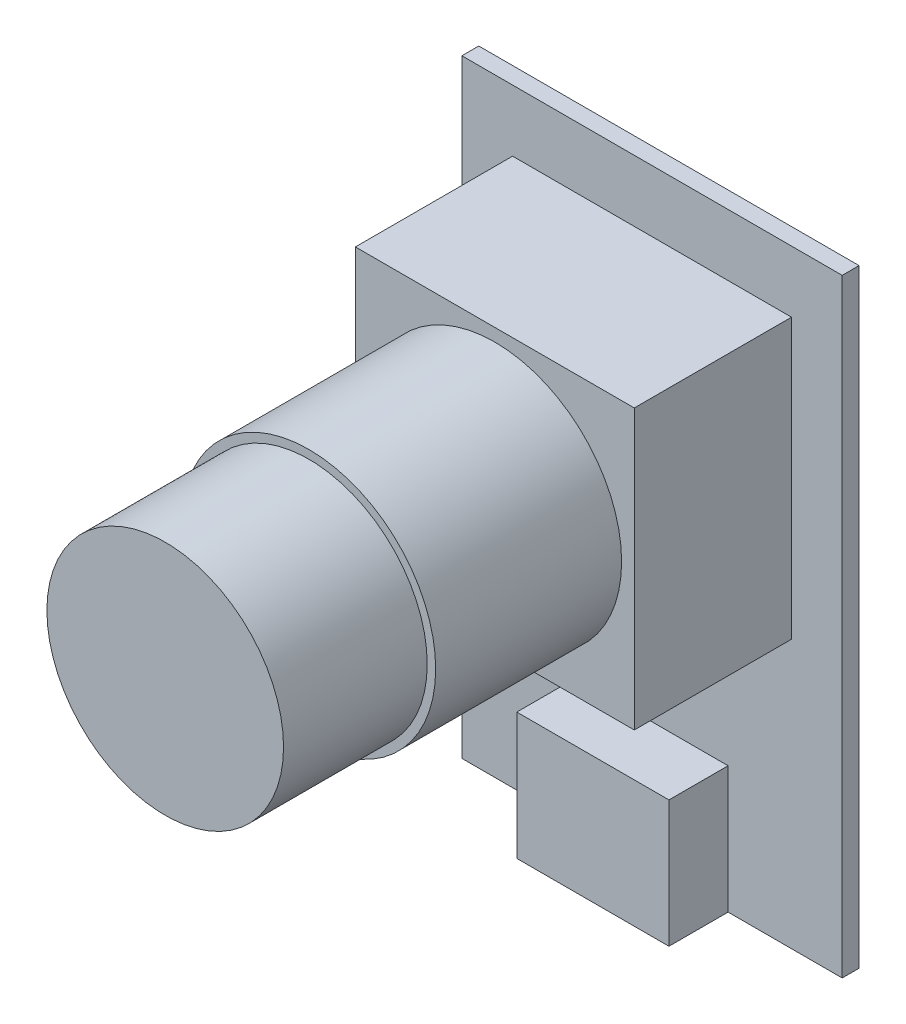
ISO-10303-21;
HEADER;
FILE_DESCRIPTION(('STEP AP214'),'2;1');
FILE_NAME('part.step','',(''),(''),'','','');
FILE_SCHEMA(('AUTOMOTIVE_DESIGN { 1 0 10303 214 1 1 1 1 }'));
ENDSEC;
DATA;
#1=APPLICATION_CONTEXT('core data for automotive mechanical design processes');
#2=APPLICATION_PROTOCOL_DEFINITION('international standard','automotive_design',2000,#1);
#3=PRODUCT_CONTEXT('',#1,'mechanical');
#4=PRODUCT('Part','Part','',(#3));
#5=PRODUCT_RELATED_PRODUCT_CATEGORY('part','',(#4));
#6=PRODUCT_DEFINITION_FORMATION('','',#4);
#7=PRODUCT_DEFINITION_CONTEXT('part definition',#1,'design');
#8=PRODUCT_DEFINITION('design','',#6,#7);
#9=PRODUCT_DEFINITION_SHAPE('','',#8);
#10=(LENGTH_UNIT() NAMED_UNIT(*) SI_UNIT(.MILLI.,.METRE.));
#11=(NAMED_UNIT(*) PLANE_ANGLE_UNIT() SI_UNIT($,.RADIAN.));
#12=(NAMED_UNIT(*) SI_UNIT($,.STERADIAN.) SOLID_ANGLE_UNIT());
#13=UNCERTAINTY_MEASURE_WITH_UNIT(LENGTH_MEASURE(1.E-05),#10,'distance_accuracy_value','');
#14=(GEOMETRIC_REPRESENTATION_CONTEXT(3) GLOBAL_UNCERTAINTY_ASSIGNED_CONTEXT((#13)) GLOBAL_UNIT_ASSIGNED_CONTEXT((#10,
#11,#12)) REPRESENTATION_CONTEXT('',''));
#15=CARTESIAN_POINT('',(0.,0.,0.));
#16=DIRECTION('',(0.,0.,1.));
#17=DIRECTION('',(1.,0.,0.));
#18=AXIS2_PLACEMENT_3D('',#15,#16,#17);
#19=CARTESIAN_POINT('',(0.,0.,1.));
#20=DIRECTION('',(0.,0.,-1.));
#21=DIRECTION('',(-1.,0.,0.));
#22=AXIS2_PLACEMENT_3D('',#19,#20,#21);
#23=PLANE('',#22);
#24=DIRECTION('',(0.,1.,0.));
#25=VECTOR('',#24,1.);
#26=CARTESIAN_POINT('',(8.25,14.3566777408638,1.));
#27=LINE('',#26,#25);
#28=CARTESIAN_POINT('',(8.25,-2.14332225913621,1.));
#29=VERTEX_POINT('',#28);
#30=CARTESIAN_POINT('',(8.25,14.3566777408638,1.));
#31=VERTEX_POINT('',#30);
#32=EDGE_CURVE('E214',#29,#31,#27,.T.);
#33=ORIENTED_EDGE('',*,*,#32,.F.);
#34=DIRECTION('',(1.,0.,0.));
#35=VECTOR('',#34,1.);
#36=CARTESIAN_POINT('',(-8.25,-2.14332225913621,1.));
#37=LINE('',#36,#35);
#38=CARTESIAN_POINT('',(-8.25,-2.14332225913621,1.));
#39=VERTEX_POINT('',#38);
#40=EDGE_CURVE('E224',#39,#29,#37,.T.);
#41=ORIENTED_EDGE('',*,*,#40,.F.);
#42=DIRECTION('',(0.,-1.,0.));
#43=VECTOR('',#42,1.);
#44=CARTESIAN_POINT('',(-8.25,14.3566777408638,1.));
#45=LINE('',#44,#43);
#46=CARTESIAN_POINT('',(-8.25,14.3566777408638,1.));
#47=VERTEX_POINT('',#46);
#48=EDGE_CURVE('E232',#47,#39,#45,.T.);
#49=ORIENTED_EDGE('',*,*,#48,.F.);
#50=DIRECTION('',(-1.,0.,0.));
#51=VECTOR('',#50,1.);
#52=CARTESIAN_POINT('',(-8.25,14.3566777408638,1.));
#53=LINE('',#52,#51);
#54=EDGE_CURVE('E231',#31,#47,#53,.T.);
#55=ORIENTED_EDGE('',*,*,#54,.F.);
#56=EDGE_LOOP('',(#33,#41,#49,#55));
#57=FACE_BOUND('',#56,.T.);
#58=DIRECTION('',(0.,-1.,0.));
#59=VECTOR('',#58,1.);
#60=CARTESIAN_POINT('',(-4.5,-10.5,1.));
#61=LINE('',#60,#59);
#62=CARTESIAN_POINT('',(-4.5,-10.5,1.));
#63=VERTEX_POINT('',#62);
#64=CARTESIAN_POINT('',(-4.5,-18.,1.));
#65=VERTEX_POINT('',#64);
#66=EDGE_CURVE('E180',#63,#65,#61,.T.);
#67=ORIENTED_EDGE('',*,*,#66,.F.);
#68=DIRECTION('',(1.,0.,0.));
#69=VECTOR('',#68,1.);
#70=CARTESIAN_POINT('',(-4.5,-10.5,1.));
#71=LINE('',#70,#69);
#72=CARTESIAN_POINT('',(4.5,-10.5,1.));
#73=VERTEX_POINT('',#72);
#74=EDGE_CURVE('E190',#63,#73,#71,.T.);
#75=ORIENTED_EDGE('',*,*,#74,.T.);
#76=DIRECTION('',(0.,-1.,0.));
#77=VECTOR('',#76,1.);
#78=CARTESIAN_POINT('',(4.5,-10.5,1.));
#79=LINE('',#78,#77);
#80=CARTESIAN_POINT('',(4.5,-18.,1.));
#81=VERTEX_POINT('',#80);
#82=EDGE_CURVE('E63',#73,#81,#79,.T.);
#83=ORIENTED_EDGE('',*,*,#82,.T.);
#84=DIRECTION('',(1.,0.,0.));
#85=VECTOR('',#84,1.);
#86=CARTESIAN_POINT('',(-11.25,-18.,1.));
#87=LINE('',#86,#85);
#88=CARTESIAN_POINT('',(11.25,-18.,1.));
#89=VERTEX_POINT('',#88);
#90=EDGE_CURVE('E259',#81,#89,#87,.T.);
#91=ORIENTED_EDGE('',*,*,#90,.T.);
#92=DIRECTION('',(0.,-1.,0.));
#93=VECTOR('',#92,1.);
#94=CARTESIAN_POINT('',(11.25,18.,1.));
#95=LINE('',#94,#93);
#96=CARTESIAN_POINT('',(11.25,18.,1.));
#97=VERTEX_POINT('',#96);
#98=EDGE_CURVE('E254',#97,#89,#95,.T.);
#99=ORIENTED_EDGE('',*,*,#98,.F.);
#100=DIRECTION('',(1.,0.,0.));
#101=VECTOR('',#100,1.);
#102=CARTESIAN_POINT('',(-11.25,18.,1.));
#103=LINE('',#102,#101);
#104=CARTESIAN_POINT('',(-11.25,18.,1.));
#105=VERTEX_POINT('',#104);
#106=EDGE_CURVE('E252',#105,#97,#103,.T.);
#107=ORIENTED_EDGE('',*,*,#106,.F.);
#108=DIRECTION('',(0.,-1.,0.));
#109=VECTOR('',#108,1.);
#110=CARTESIAN_POINT('',(-11.25,18.,1.));
#111=LINE('',#110,#109);
#112=CARTESIAN_POINT('',(-11.25,-18.,1.));
#113=VERTEX_POINT('',#112);
#114=EDGE_CURVE('E263',#105,#113,#111,.T.);
#115=ORIENTED_EDGE('',*,*,#114,.T.);
#116=EDGE_CURVE('E257',#113,#65,#87,.T.);
#117=ORIENTED_EDGE('',*,*,#116,.T.);
#118=EDGE_LOOP('',(#67,#75,#83,#91,#99,#107,#115,#117));
#119=FACE_BOUND('',#118,.T.);
#120=ADVANCED_FACE('F39',(#57,#119),#23,.F.);
#121=CARTESIAN_POINT('',(-11.25,18.,1.));
#122=DIRECTION('',(0.,1.,0.));
#123=DIRECTION('',(0.,0.,1.));
#124=AXIS2_PLACEMENT_3D('',#121,#122,#123);
#125=PLANE('',#124);
#126=DIRECTION('',(1.,0.,0.));
#127=VECTOR('',#126,1.);
#128=CARTESIAN_POINT('',(-11.25,18.,0.));
#129=LINE('',#128,#127);
#130=CARTESIAN_POINT('',(-11.25,18.,0.));
#131=VERTEX_POINT('',#130);
#132=CARTESIAN_POINT('',(11.25,18.,0.));
#133=VERTEX_POINT('',#132);
#134=EDGE_CURVE('E253',#131,#133,#129,.T.);
#135=ORIENTED_EDGE('',*,*,#134,.F.);
#136=DIRECTION('',(0.,0.,-1.));
#137=VECTOR('',#136,1.);
#138=CARTESIAN_POINT('',(-11.25,18.,1.));
#139=LINE('',#138,#137);
#140=EDGE_CURVE('E217',#105,#131,#139,.T.);
#141=ORIENTED_EDGE('',*,*,#140,.F.);
#142=ORIENTED_EDGE('',*,*,#106,.T.);
#143=DIRECTION('',(0.,0.,-1.));
#144=VECTOR('',#143,1.);
#145=CARTESIAN_POINT('',(11.25,18.,1.));
#146=LINE('',#145,#144);
#147=EDGE_CURVE('E43',#97,#133,#146,.T.);
#148=ORIENTED_EDGE('',*,*,#147,.T.);
#149=EDGE_LOOP('',(#135,#141,#142,#148));
#150=FACE_BOUND('',#149,.T.);
#151=ADVANCED_FACE('F41',(#150),#125,.T.);
#152=CARTESIAN_POINT('',(-11.25,18.,1.));
#153=DIRECTION('',(1.,0.,0.));
#154=DIRECTION('',(0.,1.,0.));
#155=AXIS2_PLACEMENT_3D('',#152,#153,#154);
#156=PLANE('',#155);
#157=DIRECTION('',(0.,-1.,0.));
#158=VECTOR('',#157,1.);
#159=CARTESIAN_POINT('',(-11.25,18.,0.));
#160=LINE('',#159,#158);
#161=CARTESIAN_POINT('',(-11.25,-18.,0.));
#162=VERTEX_POINT('',#161);
#163=EDGE_CURVE('E258',#131,#162,#160,.T.);
#164=ORIENTED_EDGE('',*,*,#163,.T.);
#165=DIRECTION('',(0.,0.,-1.));
#166=VECTOR('',#165,1.);
#167=CARTESIAN_POINT('',(-11.25,-18.,1.));
#168=LINE('',#167,#166);
#169=EDGE_CURVE('E274',#113,#162,#168,.T.);
#170=ORIENTED_EDGE('',*,*,#169,.F.);
#171=ORIENTED_EDGE('',*,*,#114,.F.);
#172=ORIENTED_EDGE('',*,*,#140,.T.);
#173=EDGE_LOOP('',(#164,#170,#171,#172));
#174=FACE_BOUND('',#173,.T.);
#175=ADVANCED_FACE('F291',(#174),#156,.F.);
#176=CARTESIAN_POINT('',(-11.25,-18.,1.));
#177=DIRECTION('',(0.,1.,0.));
#178=DIRECTION('',(0.,0.,1.));
#179=AXIS2_PLACEMENT_3D('',#176,#177,#178);
#180=PLANE('',#179);
#181=DIRECTION('',(1.,0.,0.));
#182=VECTOR('',#181,1.);
#183=CARTESIAN_POINT('',(-11.25,-18.,0.));
#184=LINE('',#183,#182);
#185=CARTESIAN_POINT('',(-5.5,-18.,0.));
#186=VERTEX_POINT('',#185);
#187=EDGE_CURVE('E271',#162,#186,#184,.T.);
#188=ORIENTED_EDGE('',*,*,#187,.T.);
#189=DIRECTION('',(0.,0.,1.));
#190=VECTOR('',#189,1.);
#191=CARTESIAN_POINT('',(-5.5,-18.,-2.));
#192=LINE('',#191,#190);
#193=CARTESIAN_POINT('',(-5.5,-18.,-2.));
#194=VERTEX_POINT('',#193);
#195=EDGE_CURVE('E57',#194,#186,#192,.T.);
#196=ORIENTED_EDGE('',*,*,#195,.F.);
#197=DIRECTION('',(-1.,0.,0.));
#198=VECTOR('',#197,1.);
#199=CARTESIAN_POINT('',(5.5,-18.,-2.));
#200=LINE('',#199,#198);
#201=CARTESIAN_POINT('',(5.5,-18.,-2.));
#202=VERTEX_POINT('',#201);
#203=EDGE_CURVE('E152',#202,#194,#200,.T.);
#204=ORIENTED_EDGE('',*,*,#203,.F.);
#205=DIRECTION('',(0.,0.,1.));
#206=VECTOR('',#205,1.);
#207=CARTESIAN_POINT('',(5.5,-18.,-2.));
#208=LINE('',#207,#206);
#209=CARTESIAN_POINT('',(5.5,-18.,0.));
#210=VERTEX_POINT('',#209);
#211=EDGE_CURVE('E157',#202,#210,#208,.T.);
#212=ORIENTED_EDGE('',*,*,#211,.T.);
#213=CARTESIAN_POINT('',(11.25,-18.,0.));
#214=VERTEX_POINT('',#213);
#215=EDGE_CURVE('E269',#210,#214,#184,.T.);
#216=ORIENTED_EDGE('',*,*,#215,.T.);
#217=DIRECTION('',(0.,0.,-1.));
#218=VECTOR('',#217,1.);
#219=CARTESIAN_POINT('',(11.25,-18.,1.));
#220=LINE('',#219,#218);
#221=EDGE_CURVE('E280',#89,#214,#220,.T.);
#222=ORIENTED_EDGE('',*,*,#221,.F.);
#223=ORIENTED_EDGE('',*,*,#90,.F.);
#224=DIRECTION('',(0.,0.,-1.));
#225=VECTOR('',#224,1.);
#226=CARTESIAN_POINT('',(4.5,-18.,4.5));
#227=LINE('',#226,#225);
#228=CARTESIAN_POINT('',(4.5,-18.,4.5));
#229=VERTEX_POINT('',#228);
#230=EDGE_CURVE('E202',#229,#81,#227,.T.);
#231=ORIENTED_EDGE('',*,*,#230,.F.);
#232=DIRECTION('',(1.,0.,0.));
#233=VECTOR('',#232,1.);
#234=CARTESIAN_POINT('',(-4.5,-18.,4.5));
#235=LINE('',#234,#233);
#236=CARTESIAN_POINT('',(-4.5,-18.,4.5));
#237=VERTEX_POINT('',#236);
#238=EDGE_CURVE('E188',#237,#229,#235,.T.);
#239=ORIENTED_EDGE('',*,*,#238,.F.);
#240=DIRECTION('',(0.,0.,-1.));
#241=VECTOR('',#240,1.);
#242=CARTESIAN_POINT('',(-4.5,-18.,4.5));
#243=LINE('',#242,#241);
#244=EDGE_CURVE('E210',#237,#65,#243,.T.);
#245=ORIENTED_EDGE('',*,*,#244,.T.);
#246=ORIENTED_EDGE('',*,*,#116,.F.);
#247=ORIENTED_EDGE('',*,*,#169,.T.);
#248=EDGE_LOOP('',(#188,#196,#204,#212,#216,#222,#223,#231,#239,#245,#246,#247));
#249=FACE_BOUND('',#248,.T.);
#250=ADVANCED_FACE('F160',(#249),#180,.F.);
#251=CARTESIAN_POINT('',(11.25,18.,1.));
#252=DIRECTION('',(1.,0.,0.));
#253=DIRECTION('',(0.,1.,0.));
#254=AXIS2_PLACEMENT_3D('',#251,#252,#253);
#255=PLANE('',#254);
#256=DIRECTION('',(0.,-1.,0.));
#257=VECTOR('',#256,1.);
#258=CARTESIAN_POINT('',(11.25,18.,0.));
#259=LINE('',#258,#257);
#260=EDGE_CURVE('E270',#133,#214,#259,.T.);
#261=ORIENTED_EDGE('',*,*,#260,.F.);
#262=ORIENTED_EDGE('',*,*,#147,.F.);
#263=ORIENTED_EDGE('',*,*,#98,.T.);
#264=ORIENTED_EDGE('',*,*,#221,.T.);
#265=EDGE_LOOP('',(#261,#262,#263,#264));
#266=FACE_BOUND('',#265,.T.);
#267=ADVANCED_FACE('F289',(#266),#255,.T.);
#268=CARTESIAN_POINT('',(0.,0.,0.));
#269=DIRECTION('',(0.,0.,-1.));
#270=DIRECTION('',(-1.,0.,0.));
#271=AXIS2_PLACEMENT_3D('',#268,#269,#270);
#272=PLANE('',#271);
#273=DIRECTION('',(0.,-1.,0.));
#274=VECTOR('',#273,1.);
#275=CARTESIAN_POINT('',(5.5,-2.4,0.));
#276=LINE('',#275,#274);
#277=CARTESIAN_POINT('',(5.5,-2.4,0.));
#278=VERTEX_POINT('',#277);
#279=EDGE_CURVE('E179',#278,#210,#276,.T.);
#280=ORIENTED_EDGE('',*,*,#279,.F.);
#281=DIRECTION('',(-1.,0.,0.));
#282=VECTOR('',#281,1.);
#283=CARTESIAN_POINT('',(5.5,-2.4,0.));
#284=LINE('',#283,#282);
#285=CARTESIAN_POINT('',(-5.5,-2.4,0.));
#286=VERTEX_POINT('',#285);
#287=EDGE_CURVE('E172',#278,#286,#284,.T.);
#288=ORIENTED_EDGE('',*,*,#287,.T.);
#289=DIRECTION('',(0.,-1.,0.));
#290=VECTOR('',#289,1.);
#291=CARTESIAN_POINT('',(-5.5,-2.4,0.));
#292=LINE('',#291,#290);
#293=EDGE_CURVE('E305',#286,#186,#292,.T.);
#294=ORIENTED_EDGE('',*,*,#293,.T.);
#295=ORIENTED_EDGE('',*,*,#187,.F.);
#296=ORIENTED_EDGE('',*,*,#163,.F.);
#297=ORIENTED_EDGE('',*,*,#134,.T.);
#298=ORIENTED_EDGE('',*,*,#260,.T.);
#299=ORIENTED_EDGE('',*,*,#215,.F.);
#300=EDGE_LOOP('',(#280,#288,#294,#295,#296,#297,#298,#299));
#301=FACE_BOUND('',#300,.T.);
#302=ADVANCED_FACE('F288',(#301),#272,.T.);
#303=CARTESIAN_POINT('',(8.25,14.3566777408638,10.3));
#304=DIRECTION('',(-1.,0.,0.));
#305=DIRECTION('',(0.,-1.,0.));
#306=AXIS2_PLACEMENT_3D('',#303,#304,#305);
#307=PLANE('',#306);
#308=ORIENTED_EDGE('',*,*,#32,.T.);
#309=DIRECTION('',(0.,0.,-1.));
#310=VECTOR('',#309,1.);
#311=CARTESIAN_POINT('',(8.25,14.3566777408638,10.3));
#312=LINE('',#311,#310);
#313=CARTESIAN_POINT('',(8.25,14.3566777408638,10.3));
#314=VERTEX_POINT('',#313);
#315=EDGE_CURVE('E250',#314,#31,#312,.T.);
#316=ORIENTED_EDGE('',*,*,#315,.F.);
#317=DIRECTION('',(0.,1.,0.));
#318=VECTOR('',#317,1.);
#319=CARTESIAN_POINT('',(8.25,14.3566777408638,10.3));
#320=LINE('',#319,#318);
#321=CARTESIAN_POINT('',(8.25,-2.14332225913621,10.3));
#322=VERTEX_POINT('',#321);
#323=EDGE_CURVE('E218',#322,#314,#320,.T.);
#324=ORIENTED_EDGE('',*,*,#323,.F.);
#325=DIRECTION('',(0.,0.,-1.));
#326=VECTOR('',#325,1.);
#327=CARTESIAN_POINT('',(8.25,-2.14332225913621,10.3));
#328=LINE('',#327,#326);
#329=EDGE_CURVE('E228',#322,#29,#328,.T.);
#330=ORIENTED_EDGE('',*,*,#329,.T.);
#331=EDGE_LOOP('',(#308,#316,#324,#330));
#332=FACE_BOUND('',#331,.T.);
#333=ADVANCED_FACE('F334',(#332),#307,.F.);
#334=CARTESIAN_POINT('',(-8.25,14.3566777408638,10.3));
#335=DIRECTION('',(0.,-1.,0.));
#336=DIRECTION('',(0.,0.,-1.));
#337=AXIS2_PLACEMENT_3D('',#334,#335,#336);
#338=PLANE('',#337);
#339=ORIENTED_EDGE('',*,*,#54,.T.);
#340=DIRECTION('',(0.,0.,-1.));
#341=VECTOR('',#340,1.);
#342=CARTESIAN_POINT('',(-8.25,14.3566777408638,10.3));
#343=LINE('',#342,#341);
#344=CARTESIAN_POINT('',(-8.25,14.3566777408638,10.3));
#345=VERTEX_POINT('',#344);
#346=EDGE_CURVE('E245',#345,#47,#343,.T.);
#347=ORIENTED_EDGE('',*,*,#346,.F.);
#348=DIRECTION('',(-1.,0.,0.));
#349=VECTOR('',#348,1.);
#350=CARTESIAN_POINT('',(-8.25,14.3566777408638,10.3));
#351=LINE('',#350,#349);
#352=EDGE_CURVE('E225',#314,#345,#351,.T.);
#353=ORIENTED_EDGE('',*,*,#352,.F.);
#354=ORIENTED_EDGE('',*,*,#315,.T.);
#355=EDGE_LOOP('',(#339,#347,#353,#354));
#356=FACE_BOUND('',#355,.T.);
#357=ADVANCED_FACE('F353',(#356),#338,.F.);
#358=CARTESIAN_POINT('',(-8.25,14.3566777408638,10.3));
#359=DIRECTION('',(1.,0.,0.));
#360=DIRECTION('',(0.,1.,0.));
#361=AXIS2_PLACEMENT_3D('',#358,#359,#360);
#362=PLANE('',#361);
#363=ORIENTED_EDGE('',*,*,#48,.T.);
#364=DIRECTION('',(0.,0.,-1.));
#365=VECTOR('',#364,1.);
#366=CARTESIAN_POINT('',(-8.25,-2.14332225913621,10.3));
#367=LINE('',#366,#365);
#368=CARTESIAN_POINT('',(-8.25,-2.14332225913621,10.3));
#369=VERTEX_POINT('',#368);
#370=EDGE_CURVE('E242',#369,#39,#367,.T.);
#371=ORIENTED_EDGE('',*,*,#370,.F.);
#372=DIRECTION('',(0.,-1.,0.));
#373=VECTOR('',#372,1.);
#374=CARTESIAN_POINT('',(-8.25,14.3566777408638,10.3));
#375=LINE('',#374,#373);
#376=EDGE_CURVE('E223',#345,#369,#375,.T.);
#377=ORIENTED_EDGE('',*,*,#376,.F.);
#378=ORIENTED_EDGE('',*,*,#346,.T.);
#379=EDGE_LOOP('',(#363,#371,#377,#378));
#380=FACE_BOUND('',#379,.T.);
#381=ADVANCED_FACE('F362',(#380),#362,.F.);
#382=CARTESIAN_POINT('',(-8.25,-2.14332225913621,10.3));
#383=DIRECTION('',(0.,1.,0.));
#384=DIRECTION('',(0.,0.,1.));
#385=AXIS2_PLACEMENT_3D('',#382,#383,#384);
#386=PLANE('',#385);
#387=ORIENTED_EDGE('',*,*,#40,.T.);
#388=ORIENTED_EDGE('',*,*,#329,.F.);
#389=DIRECTION('',(1.,0.,0.));
#390=VECTOR('',#389,1.);
#391=CARTESIAN_POINT('',(-8.25,-2.14332225913621,10.3));
#392=LINE('',#391,#390);
#393=EDGE_CURVE('E227',#369,#322,#392,.T.);
#394=ORIENTED_EDGE('',*,*,#393,.F.);
#395=ORIENTED_EDGE('',*,*,#370,.T.);
#396=EDGE_LOOP('',(#387,#388,#394,#395));
#397=FACE_BOUND('',#396,.T.);
#398=ADVANCED_FACE('F367',(#397),#386,.F.);
#399=CARTESIAN_POINT('',(0.,0.,10.3));
#400=DIRECTION('',(0.,0.,1.));
#401=DIRECTION('',(1.,0.,0.));
#402=AXIS2_PLACEMENT_3D('',#399,#400,#401);
#403=PLANE('',#402);
#404=CARTESIAN_POINT('',(0.,6.10667774086379,10.3));
#405=DIRECTION('',(0.,0.,1.));
#406=DIRECTION('',(1.,0.,0.));
#407=AXIS2_PLACEMENT_3D('',#404,#405,#406);
#408=CIRCLE('',#407,7.5);
#409=CARTESIAN_POINT('',(7.5,6.10667774086379,10.3));
#410=VERTEX_POINT('',#409);
#411=EDGE_CURVE('E48',#410,#410,#408,.T.);
#412=ORIENTED_EDGE('',*,*,#411,.F.);
#413=EDGE_LOOP('',(#412));
#414=FACE_BOUND('',#413,.T.);
#415=ORIENTED_EDGE('',*,*,#323,.T.);
#416=ORIENTED_EDGE('',*,*,#352,.T.);
#417=ORIENTED_EDGE('',*,*,#376,.T.);
#418=ORIENTED_EDGE('',*,*,#393,.T.);
#419=EDGE_LOOP('',(#415,#416,#417,#418));
#420=FACE_BOUND('',#419,.T.);
#421=ADVANCED_FACE('F377',(#414,#420),#403,.T.);
#422=CARTESIAN_POINT('',(0.,6.10667774086379,21.3));
#423=DIRECTION('',(0.,0.,-1.));
#424=DIRECTION('',(-1.,0.,0.));
#425=AXIS2_PLACEMENT_3D('',#422,#423,#424);
#426=CYLINDRICAL_SURFACE('',#425,7.5);
#427=CARTESIAN_POINT('',(0.,6.10667774086379,21.3));
#428=DIRECTION('',(0.,0.,1.));
#429=DIRECTION('',(1.,0.,0.));
#430=AXIS2_PLACEMENT_3D('',#427,#428,#429);
#431=CIRCLE('',#430,7.5);
#432=CARTESIAN_POINT('',(7.5,6.10667774086379,21.3));
#433=VERTEX_POINT('',#432);
#434=EDGE_CURVE('E211',#433,#433,#431,.T.);
#435=ORIENTED_EDGE('',*,*,#434,.F.);
#436=EDGE_LOOP('',(#435));
#437=FACE_BOUND('',#436,.T.);
#438=ORIENTED_EDGE('',*,*,#411,.T.);
#439=EDGE_LOOP('',(#438));
#440=FACE_BOUND('',#439,.T.);
#441=ADVANCED_FACE('F389',(#437,#440),#426,.T.);
#442=CARTESIAN_POINT('',(0.,6.10667774086379,21.3));
#443=DIRECTION('',(0.,0.,1.));
#444=DIRECTION('',(1.,0.,0.));
#445=AXIS2_PLACEMENT_3D('',#442,#443,#444);
#446=PLANE('',#445);
#447=CARTESIAN_POINT('',(0.,6.10667774086379,21.3));
#448=DIRECTION('',(0.,0.,1.));
#449=DIRECTION('',(1.,0.,0.));
#450=AXIS2_PLACEMENT_3D('',#447,#448,#449);
#451=CIRCLE('',#450,7.);
#452=CARTESIAN_POINT('',(7.,6.10667774086379,21.3));
#453=VERTEX_POINT('',#452);
#454=EDGE_CURVE('E11',#453,#453,#451,.T.);
#455=ORIENTED_EDGE('',*,*,#454,.F.);
#456=EDGE_LOOP('',(#455));
#457=FACE_BOUND('',#456,.T.);
#458=ORIENTED_EDGE('',*,*,#434,.T.);
#459=EDGE_LOOP('',(#458));
#460=FACE_BOUND('',#459,.T.);
#461=ADVANCED_FACE('F396',(#457,#460),#446,.T.);
#462=CARTESIAN_POINT('',(0.,6.10667774086379,29.8));
#463=DIRECTION('',(0.,0.,-1.));
#464=DIRECTION('',(-1.,0.,0.));
#465=AXIS2_PLACEMENT_3D('',#462,#463,#464);
#466=CYLINDRICAL_SURFACE('',#465,7.);
#467=CARTESIAN_POINT('',(0.,6.10667774086379,29.8));
#468=DIRECTION('',(0.,0.,1.));
#469=DIRECTION('',(1.,0.,0.));
#470=AXIS2_PLACEMENT_3D('',#467,#468,#469);
#471=CIRCLE('',#470,7.);
#472=CARTESIAN_POINT('',(7.,6.10667774086379,29.8));
#473=VERTEX_POINT('',#472);
#474=EDGE_CURVE('E207',#473,#473,#471,.T.);
#475=ORIENTED_EDGE('',*,*,#474,.F.);
#476=EDGE_LOOP('',(#475));
#477=FACE_BOUND('',#476,.T.);
#478=ORIENTED_EDGE('',*,*,#454,.T.);
#479=EDGE_LOOP('',(#478));
#480=FACE_BOUND('',#479,.T.);
#481=ADVANCED_FACE('F406',(#477,#480),#466,.T.);
#482=CARTESIAN_POINT('',(0.,6.10667774086379,29.8));
#483=DIRECTION('',(0.,0.,1.));
#484=DIRECTION('',(1.,0.,0.));
#485=AXIS2_PLACEMENT_3D('',#482,#483,#484);
#486=PLANE('',#485);
#487=ORIENTED_EDGE('',*,*,#474,.T.);
#488=EDGE_LOOP('',(#487));
#489=FACE_BOUND('',#488,.T.);
#490=ADVANCED_FACE('F413',(#489),#486,.T.);
#491=CARTESIAN_POINT('',(-4.5,-10.5,4.5));
#492=DIRECTION('',(1.,0.,0.));
#493=DIRECTION('',(0.,0.,-1.));
#494=AXIS2_PLACEMENT_3D('',#491,#492,#493);
#495=PLANE('',#494);
#496=ORIENTED_EDGE('',*,*,#66,.T.);
#497=ORIENTED_EDGE('',*,*,#244,.F.);
#498=DIRECTION('',(0.,-1.,0.));
#499=VECTOR('',#498,1.);
#500=CARTESIAN_POINT('',(-4.5,-10.5,4.5));
#501=LINE('',#500,#499);
#502=CARTESIAN_POINT('',(-4.5,-10.5,4.5));
#503=VERTEX_POINT('',#502);
#504=EDGE_CURVE('E186',#503,#237,#501,.T.);
#505=ORIENTED_EDGE('',*,*,#504,.F.);
#506=DIRECTION('',(0.,0.,-1.));
#507=VECTOR('',#506,1.);
#508=CARTESIAN_POINT('',(-4.5,-10.5,4.5));
#509=LINE('',#508,#507);
#510=EDGE_CURVE('E197',#503,#63,#509,.T.);
#511=ORIENTED_EDGE('',*,*,#510,.T.);
#512=EDGE_LOOP('',(#496,#497,#505,#511));
#513=FACE_BOUND('',#512,.T.);
#514=ADVANCED_FACE('F425',(#513),#495,.F.);
#515=CARTESIAN_POINT('',(4.5,-10.5,4.5));
#516=DIRECTION('',(1.,0.,0.));
#517=DIRECTION('',(0.,0.,-1.));
#518=AXIS2_PLACEMENT_3D('',#515,#516,#517);
#519=PLANE('',#518);
#520=ORIENTED_EDGE('',*,*,#82,.F.);
#521=DIRECTION('',(0.,0.,-1.));
#522=VECTOR('',#521,1.);
#523=CARTESIAN_POINT('',(4.5,-10.5,4.5));
#524=LINE('',#523,#522);
#525=CARTESIAN_POINT('',(4.5,-10.5,4.5));
#526=VERTEX_POINT('',#525);
#527=EDGE_CURVE('E201',#526,#73,#524,.T.);
#528=ORIENTED_EDGE('',*,*,#527,.F.);
#529=DIRECTION('',(0.,-1.,0.));
#530=VECTOR('',#529,1.);
#531=CARTESIAN_POINT('',(4.5,-10.5,4.5));
#532=LINE('',#531,#530);
#533=EDGE_CURVE('E191',#526,#229,#532,.T.);
#534=ORIENTED_EDGE('',*,*,#533,.T.);
#535=ORIENTED_EDGE('',*,*,#230,.T.);
#536=EDGE_LOOP('',(#520,#528,#534,#535));
#537=FACE_BOUND('',#536,.T.);
#538=ADVANCED_FACE('F448',(#537),#519,.T.);
#539=CARTESIAN_POINT('',(-4.5,-10.5,4.5));
#540=DIRECTION('',(0.,1.,0.));
#541=DIRECTION('',(0.,0.,1.));
#542=AXIS2_PLACEMENT_3D('',#539,#540,#541);
#543=PLANE('',#542);
#544=ORIENTED_EDGE('',*,*,#74,.F.);
#545=ORIENTED_EDGE('',*,*,#510,.F.);
#546=DIRECTION('',(1.,0.,0.));
#547=VECTOR('',#546,1.);
#548=CARTESIAN_POINT('',(-4.5,-10.5,4.5));
#549=LINE('',#548,#547);
#550=EDGE_CURVE('E192',#503,#526,#549,.T.);
#551=ORIENTED_EDGE('',*,*,#550,.T.);
#552=ORIENTED_EDGE('',*,*,#527,.T.);
#553=EDGE_LOOP('',(#544,#545,#551,#552));
#554=FACE_BOUND('',#553,.T.);
#555=ADVANCED_FACE('F459',(#554),#543,.T.);
#556=CARTESIAN_POINT('',(0.,0.,4.5));
#557=DIRECTION('',(0.,0.,1.));
#558=DIRECTION('',(1.,0.,0.));
#559=AXIS2_PLACEMENT_3D('',#556,#557,#558);
#560=PLANE('',#559);
#561=ORIENTED_EDGE('',*,*,#504,.T.);
#562=ORIENTED_EDGE('',*,*,#238,.T.);
#563=ORIENTED_EDGE('',*,*,#533,.F.);
#564=ORIENTED_EDGE('',*,*,#550,.F.);
#565=EDGE_LOOP('',(#561,#562,#563,#564));
#566=FACE_BOUND('',#565,.T.);
#567=ADVANCED_FACE('F321',(#566),#560,.T.);
#568=CARTESIAN_POINT('',(5.5,-2.4,-2.));
#569=DIRECTION('',(-1.,0.,0.));
#570=DIRECTION('',(0.,-1.,0.));
#571=AXIS2_PLACEMENT_3D('',#568,#569,#570);
#572=PLANE('',#571);
#573=ORIENTED_EDGE('',*,*,#279,.T.);
#574=ORIENTED_EDGE('',*,*,#211,.F.);
#575=DIRECTION('',(0.,-1.,0.));
#576=VECTOR('',#575,1.);
#577=CARTESIAN_POINT('',(5.5,-2.4,-2.));
#578=LINE('',#577,#576);
#579=CARTESIAN_POINT('',(5.5,-2.4,-2.));
#580=VERTEX_POINT('',#579);
#581=EDGE_CURVE('E163',#580,#202,#578,.T.);
#582=ORIENTED_EDGE('',*,*,#581,.F.);
#583=DIRECTION('',(0.,0.,1.));
#584=VECTOR('',#583,1.);
#585=CARTESIAN_POINT('',(5.5,-2.4,-2.));
#586=LINE('',#585,#584);
#587=EDGE_CURVE('E309',#580,#278,#586,.T.);
#588=ORIENTED_EDGE('',*,*,#587,.T.);
#589=EDGE_LOOP('',(#573,#574,#582,#588));
#590=FACE_BOUND('',#589,.T.);
#591=ADVANCED_FACE('F173',(#590),#572,.F.);
#592=CARTESIAN_POINT('',(-5.5,-2.4,-2.));
#593=DIRECTION('',(-1.,0.,0.));
#594=DIRECTION('',(0.,-1.,0.));
#595=AXIS2_PLACEMENT_3D('',#592,#593,#594);
#596=PLANE('',#595);
#597=ORIENTED_EDGE('',*,*,#293,.F.);
#598=DIRECTION('',(0.,0.,1.));
#599=VECTOR('',#598,1.);
#600=CARTESIAN_POINT('',(-5.5,-2.4,-2.));
#601=LINE('',#600,#599);
#602=CARTESIAN_POINT('',(-5.5,-2.4,-2.));
#603=VERTEX_POINT('',#602);
#604=EDGE_CURVE('E185',#603,#286,#601,.T.);
#605=ORIENTED_EDGE('',*,*,#604,.F.);
#606=DIRECTION('',(0.,-1.,0.));
#607=VECTOR('',#606,1.);
#608=CARTESIAN_POINT('',(-5.5,-2.4,-2.));
#609=LINE('',#608,#607);
#610=EDGE_CURVE('E162',#603,#194,#609,.T.);
#611=ORIENTED_EDGE('',*,*,#610,.T.);
#612=ORIENTED_EDGE('',*,*,#195,.T.);
#613=EDGE_LOOP('',(#597,#605,#611,#612));
#614=FACE_BOUND('',#613,.T.);
#615=ADVANCED_FACE('F311',(#614),#596,.T.);
#616=CARTESIAN_POINT('',(5.5,-2.4,-2.));
#617=DIRECTION('',(0.,1.,0.));
#618=DIRECTION('',(0.,0.,1.));
#619=AXIS2_PLACEMENT_3D('',#616,#617,#618);
#620=PLANE('',#619);
#621=ORIENTED_EDGE('',*,*,#287,.F.);
#622=ORIENTED_EDGE('',*,*,#587,.F.);
#623=DIRECTION('',(-1.,0.,0.));
#624=VECTOR('',#623,1.);
#625=CARTESIAN_POINT('',(5.5,-2.4,-2.));
#626=LINE('',#625,#624);
#627=EDGE_CURVE('E168',#580,#603,#626,.T.);
#628=ORIENTED_EDGE('',*,*,#627,.T.);
#629=ORIENTED_EDGE('',*,*,#604,.T.);
#630=EDGE_LOOP('',(#621,#622,#628,#629));
#631=FACE_BOUND('',#630,.T.);
#632=ADVANCED_FACE('F315',(#631),#620,.T.);
#633=CARTESIAN_POINT('',(0.,0.,-2.));
#634=DIRECTION('',(0.,0.,-1.));
#635=DIRECTION('',(-1.,0.,0.));
#636=AXIS2_PLACEMENT_3D('',#633,#634,#635);
#637=PLANE('',#636);
#638=ORIENTED_EDGE('',*,*,#581,.T.);
#639=ORIENTED_EDGE('',*,*,#203,.T.);
#640=ORIENTED_EDGE('',*,*,#610,.F.);
#641=ORIENTED_EDGE('',*,*,#627,.F.);
#642=EDGE_LOOP('',(#638,#639,#640,#641));
#643=FACE_BOUND('',#642,.T.);
#644=ADVANCED_FACE('F169',(#643),#637,.T.);
#645=CLOSED_SHELL('',(#120,#151,#175,#250,#267,#302,#333,#357,#381,#398,#421,#441,#461,#481,
#490,#514,#538,#555,#567,#591,#615,#632,#644));
#646=MANIFOLD_SOLID_BREP('B2',#645);
#647=ADVANCED_BREP_SHAPE_REPRESENTATION('',(#18,#646),#14);
#648=SHAPE_DEFINITION_REPRESENTATION(#9,#647);
ENDSEC;
END-ISO-10303-21;
